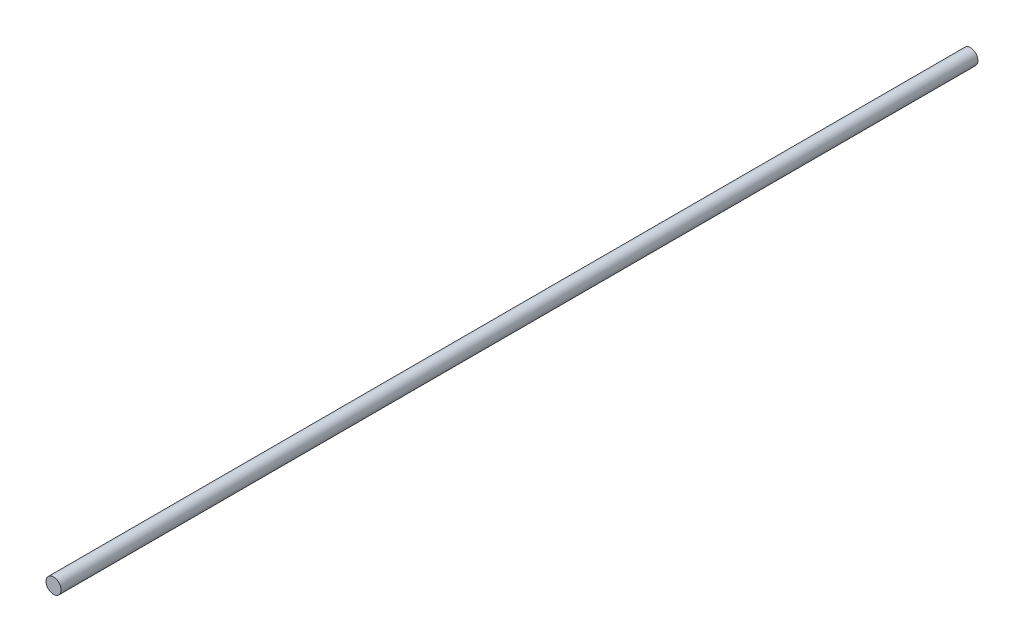
ISO-10303-21;
HEADER;
FILE_DESCRIPTION(('STEP AP214'),'2;1');
FILE_NAME('part.step','',(''),(''),'','','');
FILE_SCHEMA(('AUTOMOTIVE_DESIGN { 1 0 10303 214 1 1 1 1 }'));
ENDSEC;
DATA;
#1=APPLICATION_CONTEXT('core data for automotive mechanical design processes');
#2=APPLICATION_PROTOCOL_DEFINITION('international standard','automotive_design',2000,#1);
#3=PRODUCT_CONTEXT('',#1,'mechanical');
#4=PRODUCT('Part','Part','',(#3));
#5=PRODUCT_RELATED_PRODUCT_CATEGORY('part','',(#4));
#6=PRODUCT_DEFINITION_FORMATION('','',#4);
#7=PRODUCT_DEFINITION_CONTEXT('part definition',#1,'design');
#8=PRODUCT_DEFINITION('design','',#6,#7);
#9=PRODUCT_DEFINITION_SHAPE('','',#8);
#10=(LENGTH_UNIT() NAMED_UNIT(*) SI_UNIT(.MILLI.,.METRE.));
#11=(NAMED_UNIT(*) PLANE_ANGLE_UNIT() SI_UNIT($,.RADIAN.));
#12=(NAMED_UNIT(*) SI_UNIT($,.STERADIAN.) SOLID_ANGLE_UNIT());
#13=UNCERTAINTY_MEASURE_WITH_UNIT(LENGTH_MEASURE(1.E-05),#10,'distance_accuracy_value','');
#14=(GEOMETRIC_REPRESENTATION_CONTEXT(3) GLOBAL_UNCERTAINTY_ASSIGNED_CONTEXT((#13)) GLOBAL_UNIT_ASSIGNED_CONTEXT((#10,
#11,#12)) REPRESENTATION_CONTEXT('',''));
#15=CARTESIAN_POINT('',(0.,0.,0.));
#16=DIRECTION('',(0.,0.,1.));
#17=DIRECTION('',(1.,0.,0.));
#18=AXIS2_PLACEMENT_3D('',#15,#16,#17);
#19=CARTESIAN_POINT('',(0.,0.,0.));
#20=DIRECTION('',(0.,0.,1.));
#21=DIRECTION('',(1.,0.,0.));
#22=AXIS2_PLACEMENT_3D('',#19,#20,#21);
#23=PLANE('',#22);
#24=CARTESIAN_POINT('',(0.,0.,0.));
#25=DIRECTION('',(0.,0.,1.));
#26=DIRECTION('',(1.,0.,0.));
#27=AXIS2_PLACEMENT_3D('',#24,#25,#26);
#28=CIRCLE('',#27,76.2);
#29=CARTESIAN_POINT('',(76.2,0.,0.));
#30=VERTEX_POINT('',#29);
#31=EDGE_CURVE('E44',#30,#30,#28,.T.);
#32=ORIENTED_EDGE('',*,*,#31,.F.);
#33=EDGE_LOOP('',(#32));
#34=FACE_BOUND('',#33,.T.);
#35=ADVANCED_FACE('F37',(#34),#23,.F.);
#36=CARTESIAN_POINT('',(0.,0.,9466.13068832107));
#37=DIRECTION('',(0.,0.,-1.));
#38=DIRECTION('',(-1.,0.,0.));
#39=AXIS2_PLACEMENT_3D('',#36,#37,#38);
#40=CYLINDRICAL_SURFACE('',#39,76.2);
#41=CARTESIAN_POINT('',(0.,0.,9250.60454141542));
#42=DIRECTION('',(0.,0.,-1.));
#43=DIRECTION('',(0.,1.,0.));
#44=AXIS2_PLACEMENT_3D('',#41,#42,#43);
#45=CIRCLE('',#44,76.2);
#46=CARTESIAN_POINT('',(0.,76.2,9250.60454141542));
#47=VERTEX_POINT('',#46);
#48=EDGE_CURVE('E10',#47,#47,#45,.T.);
#49=ORIENTED_EDGE('',*,*,#48,.T.);
#50=EDGE_LOOP('',(#49));
#51=FACE_BOUND('',#50,.T.);
#52=ORIENTED_EDGE('',*,*,#31,.T.);
#53=EDGE_LOOP('',(#52));
#54=FACE_BOUND('',#53,.T.);
#55=ADVANCED_FACE('F39',(#51,#54),#40,.T.);
#56=CARTESIAN_POINT('',(243.040731476042,-73.8051681369512,9250.60454141542));
#57=DIRECTION('',(0.,0.,-1.));
#58=DIRECTION('',(0.939825535680113,0.341654741637796,0.));
#59=AXIS2_PLACEMENT_3D('',#56,#57,#58);
#60=PLANE('',#59);
#61=ORIENTED_EDGE('',*,*,#48,.F.);
#62=EDGE_LOOP('',(#61));
#63=FACE_BOUND('',#62,.T.);
#64=ADVANCED_FACE('F55',(#63),#60,.F.);
#65=CLOSED_SHELL('',(#35,#55,#64));
#66=MANIFOLD_SOLID_BREP('B2',#65);
#67=ADVANCED_BREP_SHAPE_REPRESENTATION('',(#18,#66),#14);
#68=SHAPE_DEFINITION_REPRESENTATION(#9,#67);
ENDSEC;
END-ISO-10303-21;
